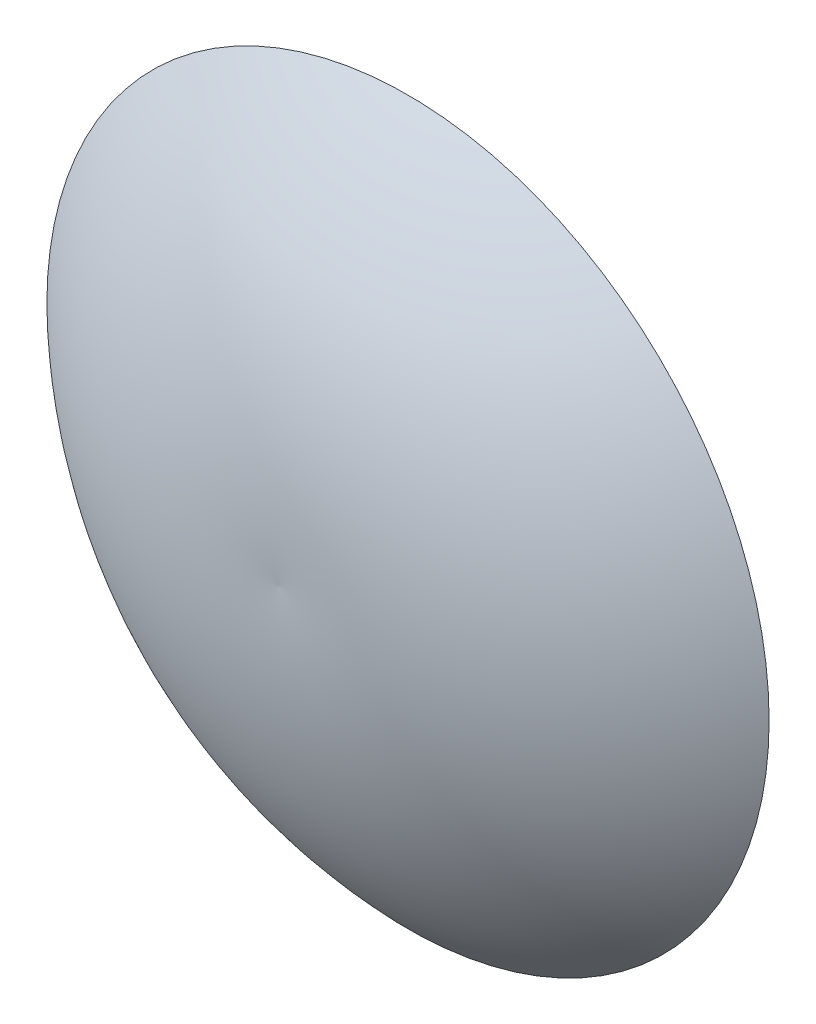
ISO-10303-21;
HEADER;
FILE_DESCRIPTION(('STEP AP214'),'2;1');
FILE_NAME('part.step','',(''),(''),'','','');
FILE_SCHEMA(('AUTOMOTIVE_DESIGN { 1 0 10303 214 1 1 1 1 }'));
ENDSEC;
DATA;
#1=APPLICATION_CONTEXT('core data for automotive mechanical design processes');
#2=APPLICATION_PROTOCOL_DEFINITION('international standard','automotive_design',2000,#1);
#3=PRODUCT_CONTEXT('',#1,'mechanical');
#4=PRODUCT('Part','Part','',(#3));
#5=PRODUCT_RELATED_PRODUCT_CATEGORY('part','',(#4));
#6=PRODUCT_DEFINITION_FORMATION('','',#4);
#7=PRODUCT_DEFINITION_CONTEXT('part definition',#1,'design');
#8=PRODUCT_DEFINITION('design','',#6,#7);
#9=PRODUCT_DEFINITION_SHAPE('','',#8);
#10=(LENGTH_UNIT() NAMED_UNIT(*) SI_UNIT(.MILLI.,.METRE.));
#11=(NAMED_UNIT(*) PLANE_ANGLE_UNIT() SI_UNIT($,.RADIAN.));
#12=(NAMED_UNIT(*) SI_UNIT($,.STERADIAN.) SOLID_ANGLE_UNIT());
#13=UNCERTAINTY_MEASURE_WITH_UNIT(LENGTH_MEASURE(1.E-05),#10,'distance_accuracy_value','');
#14=(GEOMETRIC_REPRESENTATION_CONTEXT(3) GLOBAL_UNCERTAINTY_ASSIGNED_CONTEXT((#13)) GLOBAL_UNIT_ASSIGNED_CONTEXT((#10,
#11,#12)) REPRESENTATION_CONTEXT('',''));
#15=CARTESIAN_POINT('',(0.,0.,0.));
#16=DIRECTION('',(0.,0.,1.));
#17=DIRECTION('',(1.,0.,0.));
#18=AXIS2_PLACEMENT_3D('',#15,#16,#17);
#19=CARTESIAN_POINT('',(-1556.84991236306,-1169.67465237575,1914.40138963215));
#20=DIRECTION('',(0.,-1.,0.));
#21=DIRECTION('',(1.,0.,0.));
#22=AXIS2_PLACEMENT_3D('',#19,#20,#21);
#23=CIRCLE('',#22,2715.45847756189);
#24=TRIMMED_CURVE('',#23,(PARAMETER_VALUE(-1.64081635183744)),
(PARAMETER_VALUE(1.64081635183744)),.T.,.PARAMETER.);
#25=CARTESIAN_POINT('',(-1746.83105407435,-1169.67465237575,1914.40138963215));
#26=DIRECTION('',(0.,0.,1.));
#27=AXIS1_PLACEMENT('',#25,#26);
#28=SURFACE_OF_REVOLUTION('',#24,#27);
#29=CARTESIAN_POINT('',(-1746.83105407435,-1169.67465237575,4623.20590623293));
#30=VERTEX_POINT('',#29);
#31=VERTEX_LOOP('',#30);
#32=FACE_BOUND('',#31,.T.);
#33=CARTESIAN_POINT('',(-1746.83105407435,-1169.67465237575,3891.21566822627));
#34=DIRECTION('',(0.,0.,1.));
#35=DIRECTION('',(1.,0.,0.));
#36=AXIS2_PLACEMENT_3D('',#33,#34,#35);
#37=CIRCLE('',#36,2051.6793050313);
#38=CARTESIAN_POINT('',(304.848250956948,-1169.67465237575,3891.21566822627));
#39=VERTEX_POINT('',#38);
#40=EDGE_CURVE('E11',#39,#39,#37,.T.);
#41=ORIENTED_EDGE('',*,*,#40,.T.);
#42=EDGE_LOOP('',(#41));
#43=FACE_BOUND('',#42,.T.);
#44=ADVANCED_FACE('F41',(#32,#43),#28,.T.);
#45=CARTESIAN_POINT('',(-1746.83105407435,-1169.67465237575,3891.21566822627));
#46=DIRECTION('',(0.,0.,1.));
#47=DIRECTION('',(1.,0.,0.));
#48=AXIS2_PLACEMENT_3D('',#45,#46,#47);
#49=PLANE('',#48);
#50=ORIENTED_EDGE('',*,*,#40,.F.);
#51=EDGE_LOOP('',(#50));
#52=FACE_BOUND('',#51,.T.);
#53=ADVANCED_FACE('F51',(#52),#49,.F.);
#54=CLOSED_SHELL('',(#44,#53));
#55=MANIFOLD_SOLID_BREP('B2',#54);
#56=ADVANCED_BREP_SHAPE_REPRESENTATION('',(#18,#55),#14);
#57=SHAPE_DEFINITION_REPRESENTATION(#9,#56);
ENDSEC;
END-ISO-10303-21;
